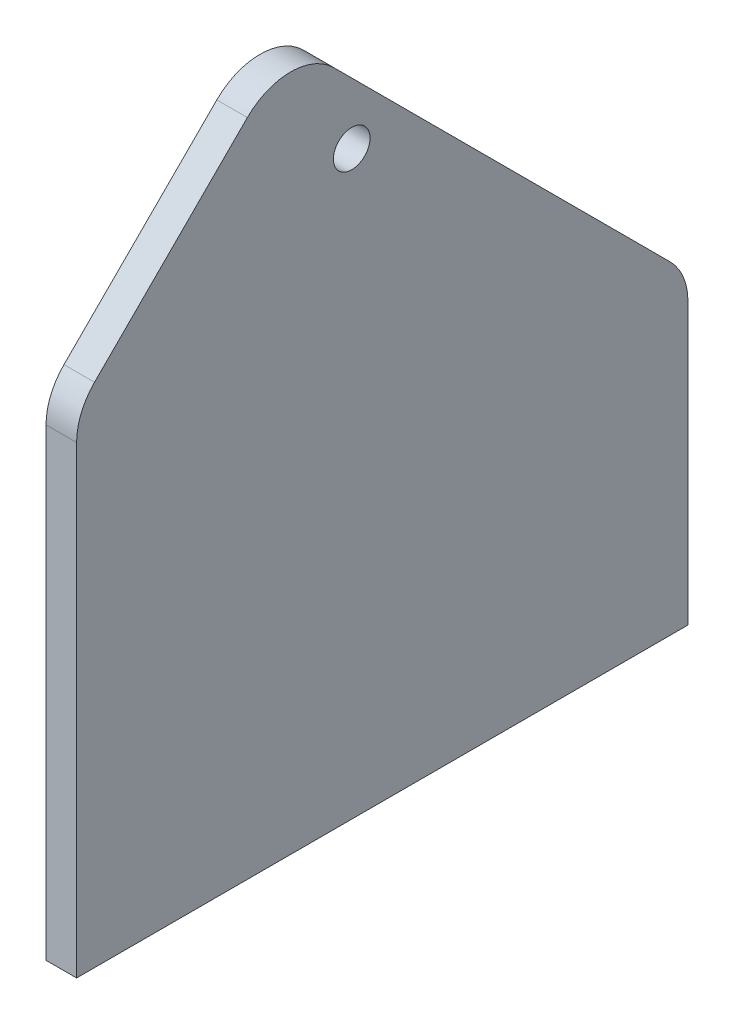
ISO-10303-21;
HEADER;
FILE_DESCRIPTION(('STEP AP214'),'2;1');
FILE_NAME('part.step','',(''),(''),'','','');
FILE_SCHEMA(('AUTOMOTIVE_DESIGN { 1 0 10303 214 1 1 1 1 }'));
ENDSEC;
DATA;
#1=APPLICATION_CONTEXT('core data for automotive mechanical design processes');
#2=APPLICATION_PROTOCOL_DEFINITION('international standard','automotive_design',2000,#1);
#3=PRODUCT_CONTEXT('',#1,'mechanical');
#4=PRODUCT('Part','Part','',(#3));
#5=PRODUCT_RELATED_PRODUCT_CATEGORY('part','',(#4));
#6=PRODUCT_DEFINITION_FORMATION('','',#4);
#7=PRODUCT_DEFINITION_CONTEXT('part definition',#1,'design');
#8=PRODUCT_DEFINITION('design','',#6,#7);
#9=PRODUCT_DEFINITION_SHAPE('','',#8);
#10=(LENGTH_UNIT() NAMED_UNIT(*) SI_UNIT(.MILLI.,.METRE.));
#11=(NAMED_UNIT(*) PLANE_ANGLE_UNIT() SI_UNIT($,.RADIAN.));
#12=(NAMED_UNIT(*) SI_UNIT($,.STERADIAN.) SOLID_ANGLE_UNIT());
#13=UNCERTAINTY_MEASURE_WITH_UNIT(LENGTH_MEASURE(1.E-05),#10,'distance_accuracy_value','');
#14=(GEOMETRIC_REPRESENTATION_CONTEXT(3) GLOBAL_UNCERTAINTY_ASSIGNED_CONTEXT((#13)) GLOBAL_UNIT_ASSIGNED_CONTEXT((#10,
#11,#12)) REPRESENTATION_CONTEXT('',''));
#15=CARTESIAN_POINT('',(0.,0.,0.));
#16=DIRECTION('',(0.,0.,1.));
#17=DIRECTION('',(1.,0.,0.));
#18=AXIS2_PLACEMENT_3D('',#15,#16,#17);
#19=CARTESIAN_POINT('',(5.,0.,0.));
#20=DIRECTION('',(0.,0.,-1.));
#21=DIRECTION('',(-1.,0.,0.));
#22=AXIS2_PLACEMENT_3D('',#19,#20,#21);
#23=PLANE('',#22);
#24=DIRECTION('',(0.,-1.,0.));
#25=VECTOR('',#24,1.);
#26=CARTESIAN_POINT('',(5.,0.,0.));
#27=LINE('',#26,#25);
#28=CARTESIAN_POINT('',(5.,75.8578643762706,0.));
#29=VERTEX_POINT('',#28);
#30=CARTESIAN_POINT('',(5.,0.,0.));
#31=VERTEX_POINT('',#30);
#32=EDGE_CURVE('E95',#29,#31,#27,.T.);
#33=ORIENTED_EDGE('',*,*,#32,.F.);
#34=DIRECTION('',(1.,0.,0.));
#35=VECTOR('',#34,1.);
#36=CARTESIAN_POINT('',(5.,75.8578643762706,0.));
#37=LINE('',#36,#35);
#38=CARTESIAN_POINT('',(0.,75.8578643762706,0.));
#39=VERTEX_POINT('',#38);
#40=EDGE_CURVE('E11',#29,#39,#37,.F.);
#41=ORIENTED_EDGE('',*,*,#40,.T.);
#42=DIRECTION('',(0.,-1.,0.));
#43=VECTOR('',#42,1.);
#44=CARTESIAN_POINT('',(0.,0.,0.));
#45=LINE('',#44,#43);
#46=CARTESIAN_POINT('',(0.,0.,0.));
#47=VERTEX_POINT('',#46);
#48=EDGE_CURVE('E116',#39,#47,#45,.T.);
#49=ORIENTED_EDGE('',*,*,#48,.T.);
#50=DIRECTION('',(-1.,0.,0.));
#51=VECTOR('',#50,1.);
#52=CARTESIAN_POINT('',(5.,0.,0.));
#53=LINE('',#52,#51);
#54=EDGE_CURVE('E109',#31,#47,#53,.T.);
#55=ORIENTED_EDGE('',*,*,#54,.F.);
#56=EDGE_LOOP('',(#33,#41,#49,#55));
#57=FACE_BOUND('',#56,.T.);
#58=ADVANCED_FACE('F35',(#57),#23,.F.);
#59=CARTESIAN_POINT('',(5.,0.,0.));
#60=DIRECTION('',(0.,1.,0.));
#61=DIRECTION('',(0.,0.,1.));
#62=AXIS2_PLACEMENT_3D('',#59,#60,#61);
#63=PLANE('',#62);
#64=DIRECTION('',(0.,0.,-1.));
#65=VECTOR('',#64,1.);
#66=CARTESIAN_POINT('',(0.,0.,0.));
#67=LINE('',#66,#65);
#68=CARTESIAN_POINT('',(0.,0.,-100.));
#69=VERTEX_POINT('',#68);
#70=EDGE_CURVE('E171',#47,#69,#67,.T.);
#71=ORIENTED_EDGE('',*,*,#70,.T.);
#72=DIRECTION('',(-1.,0.,0.));
#73=VECTOR('',#72,1.);
#74=CARTESIAN_POINT('',(5.,0.,-100.));
#75=LINE('',#74,#73);
#76=CARTESIAN_POINT('',(5.,0.,-100.));
#77=VERTEX_POINT('',#76);
#78=EDGE_CURVE('E111',#77,#69,#75,.T.);
#79=ORIENTED_EDGE('',*,*,#78,.F.);
#80=DIRECTION('',(0.,0.,-1.));
#81=VECTOR('',#80,1.);
#82=CARTESIAN_POINT('',(5.,0.,0.));
#83=LINE('',#82,#81);
#84=EDGE_CURVE('E99',#31,#77,#83,.T.);
#85=ORIENTED_EDGE('',*,*,#84,.F.);
#86=ORIENTED_EDGE('',*,*,#54,.T.);
#87=EDGE_LOOP('',(#71,#79,#85,#86));
#88=FACE_BOUND('',#87,.T.);
#89=ADVANCED_FACE('F108',(#88),#63,.F.);
#90=CARTESIAN_POINT('',(5.,0.,-100.));
#91=DIRECTION('',(0.,0.,1.));
#92=DIRECTION('',(0.,-1.,0.));
#93=AXIS2_PLACEMENT_3D('',#90,#91,#92);
#94=PLANE('',#93);
#95=DIRECTION('',(0.,1.,0.));
#96=VECTOR('',#95,1.);
#97=CARTESIAN_POINT('',(0.,0.,-100.));
#98=LINE('',#97,#96);
#99=CARTESIAN_POINT('',(0.,45.8578643762691,-100.));
#100=VERTEX_POINT('',#99);
#101=EDGE_CURVE('E174',#69,#100,#98,.T.);
#102=ORIENTED_EDGE('',*,*,#101,.T.);
#103=DIRECTION('',(-1.,0.,0.));
#104=VECTOR('',#103,1.);
#105=CARTESIAN_POINT('',(5.,45.8578643762691,-100.));
#106=LINE('',#105,#104);
#107=CARTESIAN_POINT('',(5.,45.8578643762691,-100.));
#108=VERTEX_POINT('',#107);
#109=EDGE_CURVE('E138',#100,#108,#106,.F.);
#110=ORIENTED_EDGE('',*,*,#109,.T.);
#111=DIRECTION('',(0.,1.,0.));
#112=VECTOR('',#111,1.);
#113=CARTESIAN_POINT('',(5.,0.,-100.));
#114=LINE('',#113,#112);
#115=EDGE_CURVE('E113',#77,#108,#114,.T.);
#116=ORIENTED_EDGE('',*,*,#115,.F.);
#117=ORIENTED_EDGE('',*,*,#78,.T.);
#118=EDGE_LOOP('',(#102,#110,#116,#117));
#119=FACE_BOUND('',#118,.T.);
#120=ADVANCED_FACE('F179',(#119),#94,.F.);
#121=CARTESIAN_POINT('',(5.,150.000000000002,0.));
#122=DIRECTION('',(0.,-0.707106781186542,0.707106781186553));
#123=DIRECTION('',(0.,-0.707106781186553,-0.707106781186542));
#124=AXIS2_PLACEMENT_3D('',#121,#122,#123);
#125=PLANE('',#124);
#126=DIRECTION('',(0.,0.707106781186553,0.707106781186542));
#127=VECTOR('',#126,1.);
#128=CARTESIAN_POINT('',(5.,150.000000000002,0.));
#129=LINE('',#128,#127);
#130=CARTESIAN_POINT('',(5.,52.9289321881345,-97.0710678118655));
#131=VERTEX_POINT('',#130);
#132=CARTESIAN_POINT('',(5.,107.928932188136,-42.0710678118653));
#133=VERTEX_POINT('',#132);
#134=EDGE_CURVE('E123',#131,#133,#129,.T.);
#135=ORIENTED_EDGE('',*,*,#134,.F.);
#136=DIRECTION('',(-1.,0.,0.));
#137=VECTOR('',#136,1.);
#138=CARTESIAN_POINT('',(5.,52.9289321881345,-97.0710678118655));
#139=LINE('',#138,#137);
#140=CARTESIAN_POINT('',(0.,52.9289321881345,-97.0710678118655));
#141=VERTEX_POINT('',#140);
#142=EDGE_CURVE('E129',#131,#141,#139,.T.);
#143=ORIENTED_EDGE('',*,*,#142,.T.);
#144=DIRECTION('',(0.,0.707106781186553,0.707106781186542));
#145=VECTOR('',#144,1.);
#146=CARTESIAN_POINT('',(0.,150.000000000002,0.));
#147=LINE('',#146,#145);
#148=CARTESIAN_POINT('',(0.,107.928932188136,-42.0710678118653));
#149=VERTEX_POINT('',#148);
#150=EDGE_CURVE('E104',#141,#149,#147,.T.);
#151=ORIENTED_EDGE('',*,*,#150,.T.);
#152=DIRECTION('',(1.,0.,0.));
#153=VECTOR('',#152,1.);
#154=CARTESIAN_POINT('',(5.,107.928932188136,-42.0710678118653));
#155=LINE('',#154,#153);
#156=EDGE_CURVE('E121',#149,#133,#155,.T.);
#157=ORIENTED_EDGE('',*,*,#156,.T.);
#158=EDGE_LOOP('',(#135,#143,#151,#157));
#159=FACE_BOUND('',#158,.T.);
#160=ADVANCED_FACE('F164',(#159),#125,.F.);
#161=CARTESIAN_POINT('',(5.,0.,0.));
#162=DIRECTION('',(-1.,0.,0.));
#163=DIRECTION('',(0.,0.,1.));
#164=AXIS2_PLACEMENT_3D('',#161,#162,#163);
#165=PLANE('',#164);
#166=CARTESIAN_POINT('',(5.,95.,-45.));
#167=DIRECTION('',(1.,0.,0.));
#168=DIRECTION('',(0.,0.,-1.));
#169=AXIS2_PLACEMENT_3D('',#166,#167,#168);
#170=CIRCLE('',#169,3.00000000000002);
#171=CARTESIAN_POINT('',(5.,95.,-48.));
#172=VERTEX_POINT('',#171);
#173=EDGE_CURVE('E215',#172,#172,#170,.T.);
#174=ORIENTED_EDGE('',*,*,#173,.F.);
#175=EDGE_LOOP('',(#174));
#176=FACE_BOUND('',#175,.T.);
#177=ORIENTED_EDGE('',*,*,#115,.T.);
#178=CARTESIAN_POINT('',(5.,45.8578643762691,-90.));
#179=DIRECTION('',(-1.,0.,0.));
#180=DIRECTION('',(0.,0.,1.));
#181=AXIS2_PLACEMENT_3D('',#178,#179,#180);
#182=CIRCLE('',#181,10.);
#183=EDGE_CURVE('E142',#108,#131,#182,.F.);
#184=ORIENTED_EDGE('',*,*,#183,.T.);
#185=ORIENTED_EDGE('',*,*,#134,.T.);
#186=CARTESIAN_POINT('',(5.,100.85786437627,-34.9999999999998));
#187=DIRECTION('',(-1.,0.,0.));
#188=DIRECTION('',(0.,0.,1.));
#189=AXIS2_PLACEMENT_3D('',#186,#187,#188);
#190=CIRCLE('',#189,10.);
#191=CARTESIAN_POINT('',(5.,107.928932188136,-27.9289321881343));
#192=VERTEX_POINT('',#191);
#193=EDGE_CURVE('E56',#133,#192,#190,.F.);
#194=ORIENTED_EDGE('',*,*,#193,.T.);
#195=DIRECTION('',(0.,0.707106781186545,-0.70710678118655));
#196=VECTOR('',#195,1.);
#197=CARTESIAN_POINT('',(5.,115.000000000001,-34.9999999999993));
#198=LINE('',#197,#196);
#199=CARTESIAN_POINT('',(5.,82.9289321881361,-2.92893218813455));
#200=VERTEX_POINT('',#199);
#201=EDGE_CURVE('E151',#200,#192,#198,.T.);
#202=ORIENTED_EDGE('',*,*,#201,.F.);
#203=CARTESIAN_POINT('',(5.,75.8578643762706,-10.));
#204=DIRECTION('',(-1.,0.,0.));
#205=DIRECTION('',(0.,0.,1.));
#206=AXIS2_PLACEMENT_3D('',#203,#204,#205);
#207=CIRCLE('',#206,10.);
#208=EDGE_CURVE('E50',#200,#29,#207,.F.);
#209=ORIENTED_EDGE('',*,*,#208,.T.);
#210=ORIENTED_EDGE('',*,*,#32,.T.);
#211=ORIENTED_EDGE('',*,*,#84,.T.);
#212=EDGE_LOOP('',(#177,#184,#185,#194,#202,#209,#210,#211));
#213=FACE_BOUND('',#212,.T.);
#214=ADVANCED_FACE('F98',(#176,#213),#165,.F.);
#215=CARTESIAN_POINT('',(0.,0.,0.));
#216=DIRECTION('',(-1.,0.,0.));
#217=DIRECTION('',(0.,0.,1.));
#218=AXIS2_PLACEMENT_3D('',#215,#216,#217);
#219=PLANE('',#218);
#220=ORIENTED_EDGE('',*,*,#150,.F.);
#221=CARTESIAN_POINT('',(0.,45.8578643762691,-90.));
#222=DIRECTION('',(-1.,0.,0.));
#223=DIRECTION('',(0.,0.,1.));
#224=AXIS2_PLACEMENT_3D('',#221,#222,#223);
#225=CIRCLE('',#224,10.);
#226=EDGE_CURVE('E136',#141,#100,#225,.T.);
#227=ORIENTED_EDGE('',*,*,#226,.T.);
#228=ORIENTED_EDGE('',*,*,#101,.F.);
#229=ORIENTED_EDGE('',*,*,#70,.F.);
#230=ORIENTED_EDGE('',*,*,#48,.F.);
#231=CARTESIAN_POINT('',(0.,75.8578643762706,-10.));
#232=DIRECTION('',(-1.,0.,0.));
#233=DIRECTION('',(0.,0.,1.));
#234=AXIS2_PLACEMENT_3D('',#231,#232,#233);
#235=CIRCLE('',#234,10.);
#236=CARTESIAN_POINT('',(0.,82.9289321881361,-2.92893218813454));
#237=VERTEX_POINT('',#236);
#238=EDGE_CURVE('E132',#39,#237,#235,.T.);
#239=ORIENTED_EDGE('',*,*,#238,.T.);
#240=DIRECTION('',(0.,-0.707106781186545,0.70710678118655));
#241=VECTOR('',#240,1.);
#242=CARTESIAN_POINT('',(0.,40.000000000001,40.0000000000008));
#243=LINE('',#242,#241);
#244=CARTESIAN_POINT('',(0.,107.928932188136,-27.9289321881343));
#245=VERTEX_POINT('',#244);
#246=EDGE_CURVE('E118',#245,#237,#243,.T.);
#247=ORIENTED_EDGE('',*,*,#246,.F.);
#248=CARTESIAN_POINT('',(0.,100.85786437627,-34.9999999999998));
#249=DIRECTION('',(-1.,0.,0.));
#250=DIRECTION('',(0.,0.,1.));
#251=AXIS2_PLACEMENT_3D('',#248,#249,#250);
#252=CIRCLE('',#251,10.);
#253=EDGE_CURVE('E134',#245,#149,#252,.T.);
#254=ORIENTED_EDGE('',*,*,#253,.T.);
#255=EDGE_LOOP('',(#220,#227,#228,#229,#230,#239,#247,#254));
#256=FACE_BOUND('',#255,.T.);
#257=CARTESIAN_POINT('',(0.,95.,-45.));
#258=DIRECTION('',(1.,0.,0.));
#259=DIRECTION('',(0.,0.,-1.));
#260=AXIS2_PLACEMENT_3D('',#257,#258,#259);
#261=CIRCLE('',#260,3.00000000000002);
#262=CARTESIAN_POINT('',(0.,95.,-48.));
#263=VERTEX_POINT('',#262);
#264=EDGE_CURVE('E172',#263,#263,#261,.T.);
#265=ORIENTED_EDGE('',*,*,#264,.T.);
#266=EDGE_LOOP('',(#265));
#267=FACE_BOUND('',#266,.T.);
#268=ADVANCED_FACE('F156',(#256,#267),#219,.T.);
#269=CARTESIAN_POINT('',(0.,95.,-45.));
#270=DIRECTION('',(1.,0.,0.));
#271=DIRECTION('',(0.,0.,-1.));
#272=AXIS2_PLACEMENT_3D('',#269,#270,#271);
#273=CYLINDRICAL_SURFACE('',#272,3.00000000000002);
#274=ORIENTED_EDGE('',*,*,#264,.F.);
#275=EDGE_LOOP('',(#274));
#276=FACE_BOUND('',#275,.T.);
#277=ORIENTED_EDGE('',*,*,#173,.T.);
#278=EDGE_LOOP('',(#277));
#279=FACE_BOUND('',#278,.T.);
#280=ADVANCED_FACE('F188',(#276,#279),#273,.F.);
#281=CARTESIAN_POINT('',(-5.,115.000000000001,-34.9999999999993));
#282=DIRECTION('',(0.,-0.70710678118655,-0.707106781186545));
#283=DIRECTION('',(0.,0.707106781186545,-0.70710678118655));
#284=AXIS2_PLACEMENT_3D('',#281,#282,#283);
#285=PLANE('',#284);
#286=ORIENTED_EDGE('',*,*,#201,.T.);
#287=DIRECTION('',(1.,0.,0.));
#288=VECTOR('',#287,1.);
#289=CARTESIAN_POINT('',(-5.,107.928932188136,-27.9289321881343));
#290=LINE('',#289,#288);
#291=EDGE_CURVE('E43',#192,#245,#290,.F.);
#292=ORIENTED_EDGE('',*,*,#291,.T.);
#293=ORIENTED_EDGE('',*,*,#246,.T.);
#294=DIRECTION('',(1.,0.,0.));
#295=VECTOR('',#294,1.);
#296=CARTESIAN_POINT('',(-5.,82.9289321881361,-2.92893218813454));
#297=LINE('',#296,#295);
#298=EDGE_CURVE('E144',#237,#200,#297,.T.);
#299=ORIENTED_EDGE('',*,*,#298,.T.);
#300=EDGE_LOOP('',(#286,#292,#293,#299));
#301=FACE_BOUND('',#300,.T.);
#302=ADVANCED_FACE('F149',(#301),#285,.F.);
#303=CARTESIAN_POINT('',(5.,45.8578643762691,-90.));
#304=DIRECTION('',(-1.,0.,0.));
#305=DIRECTION('',(0.,0.,1.));
#306=AXIS2_PLACEMENT_3D('',#303,#304,#305);
#307=CYLINDRICAL_SURFACE('',#306,10.);
#308=ORIENTED_EDGE('',*,*,#183,.F.);
#309=ORIENTED_EDGE('',*,*,#109,.F.);
#310=ORIENTED_EDGE('',*,*,#226,.F.);
#311=ORIENTED_EDGE('',*,*,#142,.F.);
#312=EDGE_LOOP('',(#308,#309,#310,#311));
#313=FACE_BOUND('',#312,.T.);
#314=ADVANCED_FACE('F181',(#313),#307,.T.);
#315=CARTESIAN_POINT('',(5.,100.85786437627,-34.9999999999998));
#316=DIRECTION('',(1.,0.,0.));
#317=DIRECTION('',(0.,0.,-1.));
#318=AXIS2_PLACEMENT_3D('',#315,#316,#317);
#319=CYLINDRICAL_SURFACE('',#318,10.);
#320=ORIENTED_EDGE('',*,*,#253,.F.);
#321=ORIENTED_EDGE('',*,*,#291,.F.);
#322=ORIENTED_EDGE('',*,*,#193,.F.);
#323=ORIENTED_EDGE('',*,*,#156,.F.);
#324=EDGE_LOOP('',(#320,#321,#322,#323));
#325=FACE_BOUND('',#324,.T.);
#326=ADVANCED_FACE('F161',(#325),#319,.T.);
#327=CARTESIAN_POINT('',(-5.,75.8578643762706,-10.));
#328=DIRECTION('',(1.,0.,0.));
#329=DIRECTION('',(0.,0.,-1.));
#330=AXIS2_PLACEMENT_3D('',#327,#328,#329);
#331=CYLINDRICAL_SURFACE('',#330,10.);
#332=ORIENTED_EDGE('',*,*,#238,.F.);
#333=ORIENTED_EDGE('',*,*,#40,.F.);
#334=ORIENTED_EDGE('',*,*,#208,.F.);
#335=ORIENTED_EDGE('',*,*,#298,.F.);
#336=EDGE_LOOP('',(#332,#333,#334,#335));
#337=FACE_BOUND('',#336,.T.);
#338=ADVANCED_FACE('F37',(#337),#331,.T.);
#339=CLOSED_SHELL('',(#58,#89,#120,#160,#214,#268,#280,#302,#314,#326,#338));
#340=MANIFOLD_SOLID_BREP('B2',#339);
#341=ADVANCED_BREP_SHAPE_REPRESENTATION('',(#18,#340),#14);
#342=SHAPE_DEFINITION_REPRESENTATION(#9,#341);
ENDSEC;
END-ISO-10303-21;
